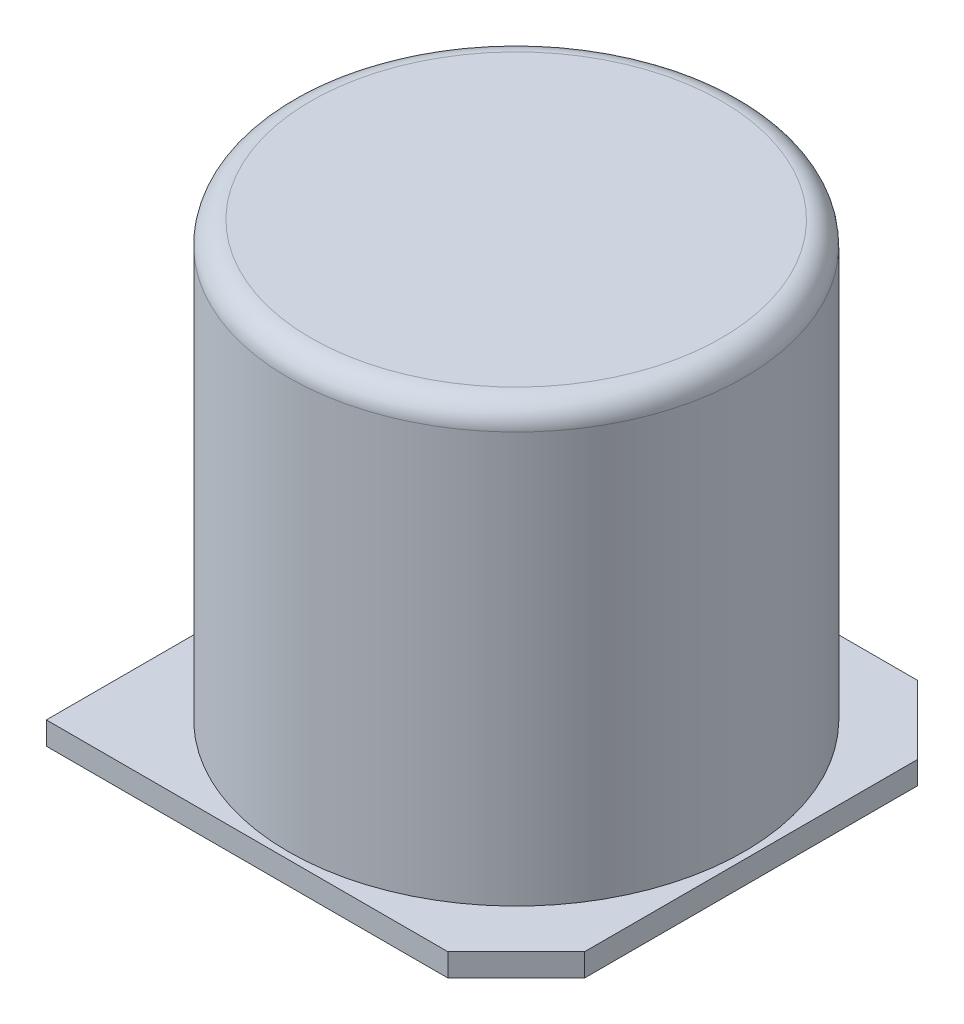
ISO-10303-21;
HEADER;
FILE_DESCRIPTION(('STEP AP214'),'2;1');
FILE_NAME('part.step','',(''),(''),'','','');
FILE_SCHEMA(('AUTOMOTIVE_DESIGN { 1 0 10303 214 1 1 1 1 }'));
ENDSEC;
DATA;
#1=APPLICATION_CONTEXT('core data for automotive mechanical design processes');
#2=APPLICATION_PROTOCOL_DEFINITION('international standard','automotive_design',2000,#1);
#3=PRODUCT_CONTEXT('',#1,'mechanical');
#4=PRODUCT('Part','Part','',(#3));
#5=PRODUCT_RELATED_PRODUCT_CATEGORY('part','',(#4));
#6=PRODUCT_DEFINITION_FORMATION('','',#4);
#7=PRODUCT_DEFINITION_CONTEXT('part definition',#1,'design');
#8=PRODUCT_DEFINITION('design','',#6,#7);
#9=PRODUCT_DEFINITION_SHAPE('','',#8);
#10=(LENGTH_UNIT() NAMED_UNIT(*) SI_UNIT(.MILLI.,.METRE.));
#11=(NAMED_UNIT(*) PLANE_ANGLE_UNIT() SI_UNIT($,.RADIAN.));
#12=(NAMED_UNIT(*) SI_UNIT($,.STERADIAN.) SOLID_ANGLE_UNIT());
#13=UNCERTAINTY_MEASURE_WITH_UNIT(LENGTH_MEASURE(1.E-05),#10,'distance_accuracy_value','');
#14=(GEOMETRIC_REPRESENTATION_CONTEXT(3) GLOBAL_UNCERTAINTY_ASSIGNED_CONTEXT((#13)) GLOBAL_UNIT_ASSIGNED_CONTEXT((#10,
#11,#12)) REPRESENTATION_CONTEXT('',''));
#15=CARTESIAN_POINT('',(0.,0.,0.));
#16=DIRECTION('',(0.,0.,1.));
#17=DIRECTION('',(1.,0.,0.));
#18=AXIS2_PLACEMENT_3D('',#15,#16,#17);
#19=CARTESIAN_POINT('',(5.15,0.5,5.15));
#20=DIRECTION('',(-1.,0.,0.));
#21=DIRECTION('',(0.,0.,1.));
#22=AXIS2_PLACEMENT_3D('',#19,#20,#21);
#23=PLANE('',#22);
#24=DIRECTION('',(0.,0.,-1.));
#25=VECTOR('',#24,1.);
#26=CARTESIAN_POINT('',(5.15,0.5,5.15));
#27=LINE('',#26,#25);
#28=CARTESIAN_POINT('',(5.15,0.5,3.65));
#29=VERTEX_POINT('',#28);
#30=CARTESIAN_POINT('',(5.15,0.5,-3.64999999999999));
#31=VERTEX_POINT('',#30);
#32=EDGE_CURVE('E103',#29,#31,#27,.T.);
#33=ORIENTED_EDGE('',*,*,#32,.F.);
#34=DIRECTION('',(0.,-1.,0.));
#35=VECTOR('',#34,1.);
#36=CARTESIAN_POINT('',(5.15,0.5,3.65));
#37=LINE('',#36,#35);
#38=CARTESIAN_POINT('',(5.15,0.,3.65));
#39=VERTEX_POINT('',#38);
#40=EDGE_CURVE('E142',#29,#39,#37,.T.);
#41=ORIENTED_EDGE('',*,*,#40,.T.);
#42=DIRECTION('',(0.,0.,-1.));
#43=VECTOR('',#42,1.);
#44=CARTESIAN_POINT('',(5.15,0.,5.15));
#45=LINE('',#44,#43);
#46=CARTESIAN_POINT('',(5.15,0.,-3.64999999999999));
#47=VERTEX_POINT('',#46);
#48=EDGE_CURVE('E125',#39,#47,#45,.T.);
#49=ORIENTED_EDGE('',*,*,#48,.T.);
#50=DIRECTION('',(0.,1.,0.));
#51=VECTOR('',#50,1.);
#52=CARTESIAN_POINT('',(5.15,0.5,-3.64999999999999));
#53=LINE('',#52,#51);
#54=EDGE_CURVE('E139',#47,#31,#53,.T.);
#55=ORIENTED_EDGE('',*,*,#54,.T.);
#56=EDGE_LOOP('',(#33,#41,#49,#55));
#57=FACE_BOUND('',#56,.T.);
#58=ADVANCED_FACE('F39',(#57),#23,.F.);
#59=CARTESIAN_POINT('',(-5.15,0.5,-5.15));
#60=DIRECTION('',(0.,0.,1.));
#61=DIRECTION('',(1.,0.,0.));
#62=AXIS2_PLACEMENT_3D('',#59,#60,#61);
#63=PLANE('',#62);
#64=DIRECTION('',(-1.,0.,0.));
#65=VECTOR('',#64,1.);
#66=CARTESIAN_POINT('',(-5.15,0.5,-5.15));
#67=LINE('',#66,#65);
#68=CARTESIAN_POINT('',(3.64999999999999,0.5,-5.15));
#69=VERTEX_POINT('',#68);
#70=CARTESIAN_POINT('',(-5.15,0.5,-5.15));
#71=VERTEX_POINT('',#70);
#72=EDGE_CURVE('E93',#69,#71,#67,.T.);
#73=ORIENTED_EDGE('',*,*,#72,.F.);
#74=DIRECTION('',(0.,-1.,0.));
#75=VECTOR('',#74,1.);
#76=CARTESIAN_POINT('',(3.65,0.5,-5.15));
#77=LINE('',#76,#75);
#78=CARTESIAN_POINT('',(3.64999999999999,0.,-5.15));
#79=VERTEX_POINT('',#78);
#80=EDGE_CURVE('E159',#69,#79,#77,.T.);
#81=ORIENTED_EDGE('',*,*,#80,.T.);
#82=DIRECTION('',(-1.,0.,0.));
#83=VECTOR('',#82,1.);
#84=CARTESIAN_POINT('',(-5.15,0.,-5.15));
#85=LINE('',#84,#83);
#86=CARTESIAN_POINT('',(-5.15,0.,-5.15));
#87=VERTEX_POINT('',#86);
#88=EDGE_CURVE('E109',#79,#87,#85,.T.);
#89=ORIENTED_EDGE('',*,*,#88,.T.);
#90=DIRECTION('',(0.,-1.,0.));
#91=VECTOR('',#90,1.);
#92=CARTESIAN_POINT('',(-5.15,0.5,-5.15));
#93=LINE('',#92,#91);
#94=EDGE_CURVE('E106',#71,#87,#93,.T.);
#95=ORIENTED_EDGE('',*,*,#94,.F.);
#96=EDGE_LOOP('',(#73,#81,#89,#95));
#97=FACE_BOUND('',#96,.T.);
#98=ADVANCED_FACE('F107',(#97),#63,.F.);
#99=CARTESIAN_POINT('',(-5.15,0.5,5.15));
#100=DIRECTION('',(1.,0.,0.));
#101=DIRECTION('',(0.,0.,-1.));
#102=AXIS2_PLACEMENT_3D('',#99,#100,#101);
#103=PLANE('',#102);
#104=DIRECTION('',(0.,0.,1.));
#105=VECTOR('',#104,1.);
#106=CARTESIAN_POINT('',(-5.15,0.,5.15));
#107=LINE('',#106,#105);
#108=CARTESIAN_POINT('',(-5.15,0.,5.15));
#109=VERTEX_POINT('',#108);
#110=EDGE_CURVE('E131',#87,#109,#107,.T.);
#111=ORIENTED_EDGE('',*,*,#110,.T.);
#112=DIRECTION('',(0.,-1.,0.));
#113=VECTOR('',#112,1.);
#114=CARTESIAN_POINT('',(-5.15,0.5,5.15));
#115=LINE('',#114,#113);
#116=CARTESIAN_POINT('',(-5.15,0.5,5.15));
#117=VERTEX_POINT('',#116);
#118=EDGE_CURVE('E114',#117,#109,#115,.T.);
#119=ORIENTED_EDGE('',*,*,#118,.F.);
#120=DIRECTION('',(0.,0.,1.));
#121=VECTOR('',#120,1.);
#122=CARTESIAN_POINT('',(-5.15,0.5,5.15));
#123=LINE('',#122,#121);
#124=EDGE_CURVE('E97',#71,#117,#123,.T.);
#125=ORIENTED_EDGE('',*,*,#124,.F.);
#126=ORIENTED_EDGE('',*,*,#94,.T.);
#127=EDGE_LOOP('',(#111,#119,#125,#126));
#128=FACE_BOUND('',#127,.T.);
#129=ADVANCED_FACE('F116',(#128),#103,.F.);
#130=CARTESIAN_POINT('',(-5.15,0.5,5.15));
#131=DIRECTION('',(0.,0.,-1.));
#132=DIRECTION('',(-1.,0.,0.));
#133=AXIS2_PLACEMENT_3D('',#130,#131,#132);
#134=PLANE('',#133);
#135=DIRECTION('',(1.,0.,0.));
#136=VECTOR('',#135,1.);
#137=CARTESIAN_POINT('',(-5.15,0.,5.15));
#138=LINE('',#137,#136);
#139=CARTESIAN_POINT('',(3.64999999999999,0.,5.15));
#140=VERTEX_POINT('',#139);
#141=EDGE_CURVE('E134',#109,#140,#138,.T.);
#142=ORIENTED_EDGE('',*,*,#141,.T.);
#143=DIRECTION('',(0.,1.,0.));
#144=VECTOR('',#143,1.);
#145=CARTESIAN_POINT('',(3.64999999999999,0.5,5.15));
#146=LINE('',#145,#144);
#147=CARTESIAN_POINT('',(3.64999999999999,0.5,5.15));
#148=VERTEX_POINT('',#147);
#149=EDGE_CURVE('E63',#140,#148,#146,.T.);
#150=ORIENTED_EDGE('',*,*,#149,.T.);
#151=DIRECTION('',(1.,0.,0.));
#152=VECTOR('',#151,1.);
#153=CARTESIAN_POINT('',(-5.15,0.5,5.15));
#154=LINE('',#153,#152);
#155=EDGE_CURVE('E119',#117,#148,#154,.T.);
#156=ORIENTED_EDGE('',*,*,#155,.F.);
#157=ORIENTED_EDGE('',*,*,#118,.T.);
#158=EDGE_LOOP('',(#142,#150,#156,#157));
#159=FACE_BOUND('',#158,.T.);
#160=ADVANCED_FACE('F206',(#159),#134,.F.);
#161=CARTESIAN_POINT('',(0.,0.5,0.));
#162=DIRECTION('',(0.,-1.,0.));
#163=DIRECTION('',(0.,0.,-1.));
#164=AXIS2_PLACEMENT_3D('',#161,#162,#163);
#165=PLANE('',#164);
#166=CARTESIAN_POINT('',(0.,0.5,0.));
#167=DIRECTION('',(0.,1.,0.));
#168=DIRECTION('',(0.,0.,1.));
#169=AXIS2_PLACEMENT_3D('',#166,#167,#168);
#170=CIRCLE('',#169,5.);
#171=CARTESIAN_POINT('',(0.,0.5,5.));
#172=VERTEX_POINT('',#171);
#173=EDGE_CURVE('E113',#172,#172,#170,.T.);
#174=ORIENTED_EDGE('',*,*,#173,.F.);
#175=EDGE_LOOP('',(#174));
#176=FACE_BOUND('',#175,.T.);
#177=ORIENTED_EDGE('',*,*,#155,.T.);
#178=DIRECTION('',(-0.707106781186549,0.,0.707106781186546));
#179=VECTOR('',#178,1.);
#180=CARTESIAN_POINT('',(5.15,0.5,3.65));
#181=LINE('',#180,#179);
#182=EDGE_CURVE('E156',#148,#29,#181,.F.);
#183=ORIENTED_EDGE('',*,*,#182,.T.);
#184=ORIENTED_EDGE('',*,*,#32,.T.);
#185=DIRECTION('',(0.707106781186546,0.,0.707106781186549));
#186=VECTOR('',#185,1.);
#187=CARTESIAN_POINT('',(3.65,0.5,-5.15));
#188=LINE('',#187,#186);
#189=EDGE_CURVE('E55',#31,#69,#188,.F.);
#190=ORIENTED_EDGE('',*,*,#189,.T.);
#191=ORIENTED_EDGE('',*,*,#72,.T.);
#192=ORIENTED_EDGE('',*,*,#124,.T.);
#193=EDGE_LOOP('',(#177,#183,#184,#190,#191,#192));
#194=FACE_BOUND('',#193,.T.);
#195=ADVANCED_FACE('F95',(#176,#194),#165,.F.);
#196=CARTESIAN_POINT('',(0.,0.,0.));
#197=DIRECTION('',(0.,-1.,0.));
#198=DIRECTION('',(0.,0.,-1.));
#199=AXIS2_PLACEMENT_3D('',#196,#197,#198);
#200=PLANE('',#199);
#201=ORIENTED_EDGE('',*,*,#48,.F.);
#202=DIRECTION('',(0.707106781186549,0.,-0.707106781186546));
#203=VECTOR('',#202,1.);
#204=CARTESIAN_POINT('',(4.39999999999999,0.,4.40000000000001));
#205=LINE('',#204,#203);
#206=EDGE_CURVE('E149',#39,#140,#205,.F.);
#207=ORIENTED_EDGE('',*,*,#206,.T.);
#208=ORIENTED_EDGE('',*,*,#141,.F.);
#209=ORIENTED_EDGE('',*,*,#110,.F.);
#210=ORIENTED_EDGE('',*,*,#88,.F.);
#211=DIRECTION('',(-0.707106781186546,0.,-0.707106781186549));
#212=VECTOR('',#211,1.);
#213=CARTESIAN_POINT('',(4.4,0.,-4.39999999999999));
#214=LINE('',#213,#212);
#215=EDGE_CURVE('E146',#79,#47,#214,.F.);
#216=ORIENTED_EDGE('',*,*,#215,.T.);
#217=EDGE_LOOP('',(#201,#207,#208,#209,#210,#216));
#218=FACE_BOUND('',#217,.T.);
#219=ADVANCED_FACE('F205',(#218),#200,.T.);
#220=CARTESIAN_POINT('',(0.,10.,0.));
#221=DIRECTION('',(0.,-1.,0.));
#222=DIRECTION('',(0.,0.,-1.));
#223=AXIS2_PLACEMENT_3D('',#220,#221,#222);
#224=CYLINDRICAL_SURFACE('',#223,5.);
#225=CARTESIAN_POINT('',(0.,9.5,0.));
#226=DIRECTION('',(0.,1.,0.));
#227=DIRECTION('',(0.,0.,1.));
#228=AXIS2_PLACEMENT_3D('',#225,#226,#227);
#229=CIRCLE('',#228,5.);
#230=CARTESIAN_POINT('',(0.,9.5,5.));
#231=VERTEX_POINT('',#230);
#232=EDGE_CURVE('E11',#231,#231,#229,.F.);
#233=ORIENTED_EDGE('',*,*,#232,.T.);
#234=EDGE_LOOP('',(#233));
#235=FACE_BOUND('',#234,.T.);
#236=ORIENTED_EDGE('',*,*,#173,.T.);
#237=EDGE_LOOP('',(#236));
#238=FACE_BOUND('',#237,.T.);
#239=ADVANCED_FACE('F191',(#235,#238),#224,.T.);
#240=CARTESIAN_POINT('',(0.,10.,0.));
#241=DIRECTION('',(0.,1.,0.));
#242=DIRECTION('',(0.,0.,1.));
#243=AXIS2_PLACEMENT_3D('',#240,#241,#242);
#244=PLANE('',#243);
#245=CARTESIAN_POINT('',(0.,10.,0.));
#246=DIRECTION('',(0.,1.,0.));
#247=DIRECTION('',(0.,0.,1.));
#248=AXIS2_PLACEMENT_3D('',#245,#246,#247);
#249=CIRCLE('',#248,4.5);
#250=CARTESIAN_POINT('',(0.,10.,4.5));
#251=VERTEX_POINT('',#250);
#252=EDGE_CURVE('E48',#251,#251,#249,.T.);
#253=ORIENTED_EDGE('',*,*,#252,.T.);
#254=EDGE_LOOP('',(#253));
#255=FACE_BOUND('',#254,.T.);
#256=ADVANCED_FACE('F165',(#255),#244,.T.);
#257=CARTESIAN_POINT('',(5.15,0.5,3.65));
#258=DIRECTION('',(-0.707106781186546,0.,-0.707106781186549));
#259=DIRECTION('',(0.,-1.,0.));
#260=AXIS2_PLACEMENT_3D('',#257,#258,#259);
#261=PLANE('',#260);
#262=ORIENTED_EDGE('',*,*,#182,.F.);
#263=ORIENTED_EDGE('',*,*,#149,.F.);
#264=ORIENTED_EDGE('',*,*,#206,.F.);
#265=ORIENTED_EDGE('',*,*,#40,.F.);
#266=EDGE_LOOP('',(#262,#263,#264,#265));
#267=FACE_BOUND('',#266,.T.);
#268=ADVANCED_FACE('F173',(#267),#261,.F.);
#269=CARTESIAN_POINT('',(3.65,0.5,-5.15));
#270=DIRECTION('',(-0.707106781186549,0.,0.707106781186546));
#271=DIRECTION('',(0.,-1.,0.));
#272=AXIS2_PLACEMENT_3D('',#269,#270,#271);
#273=PLANE('',#272);
#274=ORIENTED_EDGE('',*,*,#189,.F.);
#275=ORIENTED_EDGE('',*,*,#54,.F.);
#276=ORIENTED_EDGE('',*,*,#215,.F.);
#277=ORIENTED_EDGE('',*,*,#80,.F.);
#278=EDGE_LOOP('',(#274,#275,#276,#277));
#279=FACE_BOUND('',#278,.T.);
#280=ADVANCED_FACE('F168',(#279),#273,.F.);
#281=CARTESIAN_POINT('',(0.,9.5,0.));
#282=DIRECTION('',(0.,1.,0.));
#283=DIRECTION('',(0.,0.,1.));
#284=AXIS2_PLACEMENT_3D('',#281,#282,#283);
#285=TOROIDAL_SURFACE('',#284,4.5,0.5);
#286=ORIENTED_EDGE('',*,*,#232,.F.);
#287=EDGE_LOOP('',(#286));
#288=FACE_BOUND('',#287,.T.);
#289=ORIENTED_EDGE('',*,*,#252,.F.);
#290=EDGE_LOOP('',(#289));
#291=FACE_BOUND('',#290,.T.);
#292=ADVANCED_FACE('F41',(#288,#291),#285,.T.);
#293=CLOSED_SHELL('',(#58,#98,#129,#160,#195,#219,#239,#256,#268,#280,#292));
#294=MANIFOLD_SOLID_BREP('B2',#293);
#295=ADVANCED_BREP_SHAPE_REPRESENTATION('',(#18,#294),#14);
#296=SHAPE_DEFINITION_REPRESENTATION(#9,#295);
ENDSEC;
END-ISO-10303-21;
